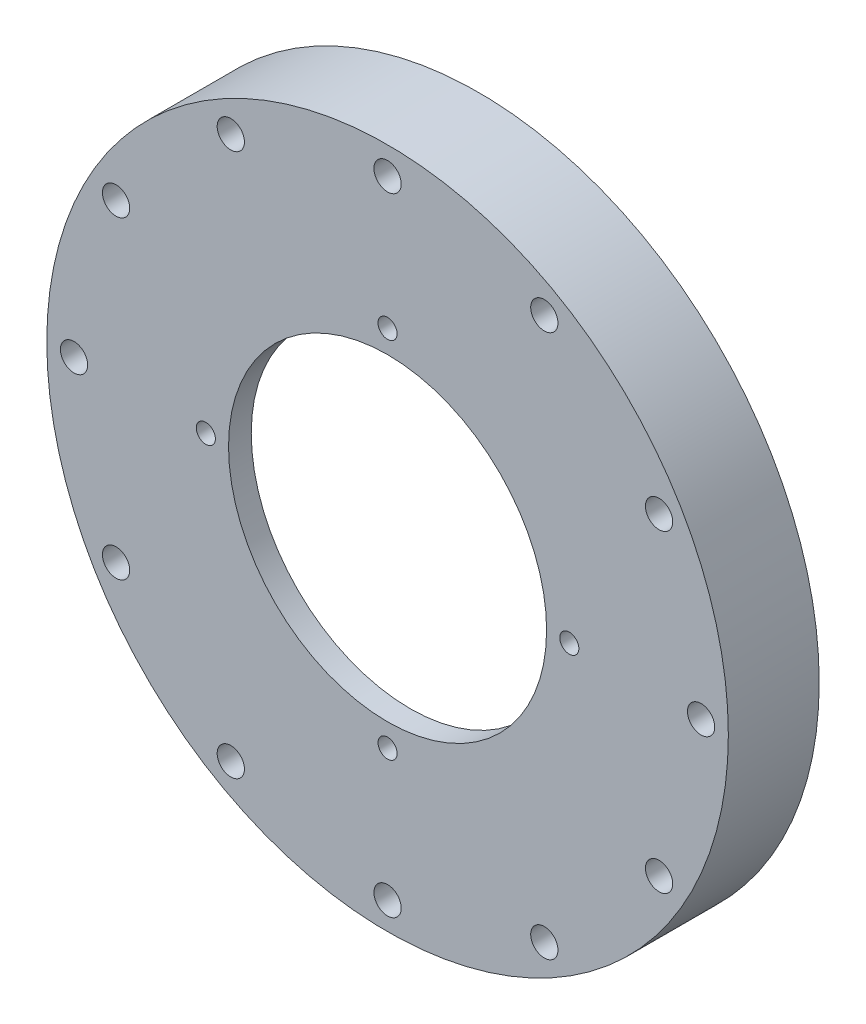
ISO-10303-21;
HEADER;
FILE_DESCRIPTION(('STEP AP214'),'2;1');
FILE_NAME('part.step','',(''),(''),'','','');
FILE_SCHEMA(('AUTOMOTIVE_DESIGN { 1 0 10303 214 1 1 1 1 }'));
ENDSEC;
DATA;
#1=APPLICATION_CONTEXT('core data for automotive mechanical design processes');
#2=APPLICATION_PROTOCOL_DEFINITION('international standard','automotive_design',2000,#1);
#3=PRODUCT_CONTEXT('',#1,'mechanical');
#4=PRODUCT('Part','Part','',(#3));
#5=PRODUCT_RELATED_PRODUCT_CATEGORY('part','',(#4));
#6=PRODUCT_DEFINITION_FORMATION('','',#4);
#7=PRODUCT_DEFINITION_CONTEXT('part definition',#1,'design');
#8=PRODUCT_DEFINITION('design','',#6,#7);
#9=PRODUCT_DEFINITION_SHAPE('','',#8);
#10=(LENGTH_UNIT() NAMED_UNIT(*) SI_UNIT(.MILLI.,.METRE.));
#11=(NAMED_UNIT(*) PLANE_ANGLE_UNIT() SI_UNIT($,.RADIAN.));
#12=(NAMED_UNIT(*) SI_UNIT($,.STERADIAN.) SOLID_ANGLE_UNIT());
#13=UNCERTAINTY_MEASURE_WITH_UNIT(LENGTH_MEASURE(1.E-05),#10,'distance_accuracy_value','');
#14=(GEOMETRIC_REPRESENTATION_CONTEXT(3) GLOBAL_UNCERTAINTY_ASSIGNED_CONTEXT((#13)) GLOBAL_UNIT_ASSIGNED_CONTEXT((#10,
#11,#12)) REPRESENTATION_CONTEXT('',''));
#15=CARTESIAN_POINT('',(0.,0.,0.));
#16=DIRECTION('',(0.,0.,1.));
#17=DIRECTION('',(1.,0.,0.));
#18=AXIS2_PLACEMENT_3D('',#15,#16,#17);
#19=CARTESIAN_POINT('',(0.,0.,20.));
#20=DIRECTION('',(0.,0.,1.));
#21=DIRECTION('',(1.,0.,0.));
#22=AXIS2_PLACEMENT_3D('',#19,#20,#21);
#23=PLANE('',#22);
#24=CARTESIAN_POINT('',(0.,40.,20.));
#25=DIRECTION('',(0.,0.,1.));
#26=DIRECTION('',(1.,0.,0.));
#27=AXIS2_PLACEMENT_3D('',#24,#25,#26);
#28=CIRCLE('',#27,2.09999999999999);
#29=CARTESIAN_POINT('',(2.09999999999999,40.,20.));
#30=VERTEX_POINT('',#29);
#31=EDGE_CURVE('E203',#30,#30,#28,.T.);
#32=ORIENTED_EDGE('',*,*,#31,.F.);
#33=EDGE_LOOP('',(#32));
#34=FACE_BOUND('',#33,.T.);
#35=CARTESIAN_POINT('',(40.,0.,20.));
#36=DIRECTION('',(0.,0.,1.));
#37=DIRECTION('',(1.,0.,0.));
#38=AXIS2_PLACEMENT_3D('',#35,#36,#37);
#39=CIRCLE('',#38,2.09999999999998);
#40=CARTESIAN_POINT('',(42.1,0.,20.));
#41=VERTEX_POINT('',#40);
#42=EDGE_CURVE('E195',#41,#41,#39,.T.);
#43=ORIENTED_EDGE('',*,*,#42,.F.);
#44=EDGE_LOOP('',(#43));
#45=FACE_BOUND('',#44,.T.);
#46=CARTESIAN_POINT('',(0.,-40.,20.));
#47=DIRECTION('',(0.,0.,1.));
#48=DIRECTION('',(1.,0.,0.));
#49=AXIS2_PLACEMENT_3D('',#46,#47,#48);
#50=CIRCLE('',#49,2.09999999999999);
#51=CARTESIAN_POINT('',(2.09999999999999,-40.,20.));
#52=VERTEX_POINT('',#51);
#53=EDGE_CURVE('E187',#52,#52,#50,.T.);
#54=ORIENTED_EDGE('',*,*,#53,.F.);
#55=EDGE_LOOP('',(#54));
#56=FACE_BOUND('',#55,.T.);
#57=CARTESIAN_POINT('',(-40.,0.,20.));
#58=DIRECTION('',(0.,0.,1.));
#59=DIRECTION('',(1.,0.,0.));
#60=AXIS2_PLACEMENT_3D('',#57,#58,#59);
#61=CIRCLE('',#60,2.09999999999998);
#62=CARTESIAN_POINT('',(-37.9,0.,20.));
#63=VERTEX_POINT('',#62);
#64=EDGE_CURVE('E179',#63,#63,#61,.T.);
#65=ORIENTED_EDGE('',*,*,#64,.F.);
#66=EDGE_LOOP('',(#65));
#67=FACE_BOUND('',#66,.T.);
#68=CARTESIAN_POINT('',(-34.5000000000011,-59.7557528611256,20.));
#69=DIRECTION('',(0.,0.,1.));
#70=DIRECTION('',(1.,0.,0.));
#71=AXIS2_PLACEMENT_3D('',#68,#69,#70);
#72=CIRCLE('',#71,3.00000000000001);
#73=CARTESIAN_POINT('',(-31.5000000000011,-59.7557528611256,20.));
#74=VERTEX_POINT('',#73);
#75=EDGE_CURVE('E148',#74,#74,#72,.T.);
#76=ORIENTED_EDGE('',*,*,#75,.F.);
#77=EDGE_LOOP('',(#76));
#78=FACE_BOUND('',#77,.T.);
#79=CARTESIAN_POINT('',(34.499999999999,-59.7557528611268,20.));
#80=DIRECTION('',(0.,0.,1.));
#81=DIRECTION('',(1.,0.,0.));
#82=AXIS2_PLACEMENT_3D('',#79,#80,#81);
#83=CIRCLE('',#82,3.00000000000001);
#84=CARTESIAN_POINT('',(37.499999999999,-59.7557528611268,20.));
#85=VERTEX_POINT('',#84);
#86=EDGE_CURVE('E132',#85,#85,#83,.T.);
#87=ORIENTED_EDGE('',*,*,#86,.F.);
#88=EDGE_LOOP('',(#87));
#89=FACE_BOUND('',#88,.T.);
#90=CARTESIAN_POINT('',(69.,-9.60157368181862E-13,20.));
#91=DIRECTION('',(0.,0.,1.));
#92=DIRECTION('',(1.,0.,0.));
#93=AXIS2_PLACEMENT_3D('',#90,#91,#92);
#94=CIRCLE('',#93,3.);
#95=CARTESIAN_POINT('',(72.,-9.60157368181862E-13,20.));
#96=VERTEX_POINT('',#95);
#97=EDGE_CURVE('E116',#96,#96,#94,.T.);
#98=ORIENTED_EDGE('',*,*,#97,.F.);
#99=EDGE_LOOP('',(#98));
#100=FACE_BOUND('',#99,.T.);
#101=CARTESIAN_POINT('',(59.7557528611267,34.4999999999992,20.));
#102=DIRECTION('',(0.,0.,1.));
#103=DIRECTION('',(1.,0.,0.));
#104=AXIS2_PLACEMENT_3D('',#101,#102,#103);
#105=CIRCLE('',#104,3.);
#106=CARTESIAN_POINT('',(62.7557528611267,34.4999999999992,20.));
#107=VERTEX_POINT('',#106);
#108=EDGE_CURVE('E100',#107,#107,#105,.T.);
#109=ORIENTED_EDGE('',*,*,#108,.F.);
#110=EDGE_LOOP('',(#109));
#111=FACE_BOUND('',#110,.T.);
#112=CARTESIAN_POINT('',(7.331229436095E-13,69.,20.));
#113=DIRECTION('',(0.,0.,1.));
#114=DIRECTION('',(1.,0.,0.));
#115=AXIS2_PLACEMENT_3D('',#112,#113,#114);
#116=CIRCLE('',#115,3.);
#117=CARTESIAN_POINT('',(3.00000000000074,69.,20.));
#118=VERTEX_POINT('',#117);
#119=EDGE_CURVE('E84',#118,#118,#116,.T.);
#120=ORIENTED_EDGE('',*,*,#119,.F.);
#121=EDGE_LOOP('',(#120));
#122=FACE_BOUND('',#121,.T.);
#123=CARTESIAN_POINT('',(-59.755752861126,34.5000000000005,20.));
#124=DIRECTION('',(0.,0.,1.));
#125=DIRECTION('',(1.,0.,0.));
#126=AXIS2_PLACEMENT_3D('',#123,#124,#125);
#127=CIRCLE('',#126,3.00000000000001);
#128=CARTESIAN_POINT('',(-56.755752861126,34.5000000000005,20.));
#129=VERTEX_POINT('',#128);
#130=EDGE_CURVE('E71',#129,#129,#127,.T.);
#131=ORIENTED_EDGE('',*,*,#130,.F.);
#132=EDGE_LOOP('',(#131));
#133=FACE_BOUND('',#132,.T.);
#134=CARTESIAN_POINT('',(0.,0.,20.));
#135=DIRECTION('',(0.,0.,1.));
#136=DIRECTION('',(1.,0.,0.));
#137=AXIS2_PLACEMENT_3D('',#134,#135,#136);
#138=CIRCLE('',#137,75.);
#139=CARTESIAN_POINT('',(75.,0.,20.));
#140=VERTEX_POINT('',#139);
#141=EDGE_CURVE('E12',#140,#140,#138,.T.);
#142=ORIENTED_EDGE('',*,*,#141,.T.);
#143=EDGE_LOOP('',(#142));
#144=FACE_BOUND('',#143,.T.);
#145=CARTESIAN_POINT('',(0.,0.,20.));
#146=DIRECTION('',(0.,0.,1.));
#147=DIRECTION('',(1.,0.,0.));
#148=AXIS2_PLACEMENT_3D('',#145,#146,#147);
#149=CIRCLE('',#148,35.);
#150=CARTESIAN_POINT('',(35.,0.,20.));
#151=VERTEX_POINT('',#150);
#152=EDGE_CURVE('E66',#151,#151,#149,.T.);
#153=ORIENTED_EDGE('',*,*,#152,.F.);
#154=EDGE_LOOP('',(#153));
#155=FACE_BOUND('',#154,.T.);
#156=CARTESIAN_POINT('',(-34.4999999999994,59.7557528611266,20.));
#157=DIRECTION('',(0.,0.,1.));
#158=DIRECTION('',(1.,0.,0.));
#159=AXIS2_PLACEMENT_3D('',#156,#157,#158);
#160=CIRCLE('',#159,3.);
#161=CARTESIAN_POINT('',(-31.4999999999994,59.7557528611266,20.));
#162=VERTEX_POINT('',#161);
#163=EDGE_CURVE('E76',#162,#162,#160,.T.);
#164=ORIENTED_EDGE('',*,*,#163,.F.);
#165=EDGE_LOOP('',(#164));
#166=FACE_BOUND('',#165,.T.);
#167=CARTESIAN_POINT('',(34.5000000000007,59.7557528611259,20.));
#168=DIRECTION('',(0.,0.,1.));
#169=DIRECTION('',(1.,0.,0.));
#170=AXIS2_PLACEMENT_3D('',#167,#168,#169);
#171=CIRCLE('',#170,3.00000000000002);
#172=CARTESIAN_POINT('',(37.5000000000007,59.7557528611259,20.));
#173=VERTEX_POINT('',#172);
#174=EDGE_CURVE('E92',#173,#173,#171,.T.);
#175=ORIENTED_EDGE('',*,*,#174,.F.);
#176=EDGE_LOOP('',(#175));
#177=FACE_BOUND('',#176,.T.);
#178=CARTESIAN_POINT('',(-69.,4.78332943421509E-13,20.));
#179=DIRECTION('',(0.,0.,1.));
#180=DIRECTION('',(1.,0.,0.));
#181=AXIS2_PLACEMENT_3D('',#178,#179,#180);
#182=CIRCLE('',#181,3.00000000000001);
#183=CARTESIAN_POINT('',(-66.,4.78332943421509E-13,20.));
#184=VERTEX_POINT('',#183);
#185=EDGE_CURVE('E108',#184,#184,#182,.T.);
#186=ORIENTED_EDGE('',*,*,#185,.F.);
#187=EDGE_LOOP('',(#186));
#188=FACE_BOUND('',#187,.T.);
#189=CARTESIAN_POINT('',(59.7557528611258,-34.5000000000009,20.));
#190=DIRECTION('',(0.,0.,1.));
#191=DIRECTION('',(1.,0.,0.));
#192=AXIS2_PLACEMENT_3D('',#189,#190,#191);
#193=CIRCLE('',#192,3.00000000000001);
#194=CARTESIAN_POINT('',(62.7557528611258,-34.5000000000009,20.));
#195=VERTEX_POINT('',#194);
#196=EDGE_CURVE('E124',#195,#195,#193,.T.);
#197=ORIENTED_EDGE('',*,*,#196,.F.);
#198=EDGE_LOOP('',(#197));
#199=FACE_BOUND('',#198,.T.);
#200=CARTESIAN_POINT('',(-1.21494736836985E-12,-69.,20.));
#201=DIRECTION('',(0.,0.,1.));
#202=DIRECTION('',(1.,0.,0.));
#203=AXIS2_PLACEMENT_3D('',#200,#201,#202);
#204=CIRCLE('',#203,3.00000000000001);
#205=CARTESIAN_POINT('',(2.9999999999988,-69.,20.));
#206=VERTEX_POINT('',#205);
#207=EDGE_CURVE('E140',#206,#206,#204,.T.);
#208=ORIENTED_EDGE('',*,*,#207,.F.);
#209=EDGE_LOOP('',(#208));
#210=FACE_BOUND('',#209,.T.);
#211=CARTESIAN_POINT('',(-59.7557528611269,-34.4999999999988,20.));
#212=DIRECTION('',(0.,0.,1.));
#213=DIRECTION('',(1.,0.,0.));
#214=AXIS2_PLACEMENT_3D('',#211,#212,#213);
#215=CIRCLE('',#214,3.00000000000001);
#216=CARTESIAN_POINT('',(-56.7557528611269,-34.4999999999988,20.));
#217=VERTEX_POINT('',#216);
#218=EDGE_CURVE('E156',#217,#217,#215,.T.);
#219=ORIENTED_EDGE('',*,*,#218,.F.);
#220=EDGE_LOOP('',(#219));
#221=FACE_BOUND('',#220,.T.);
#222=ADVANCED_FACE('F51',(#34,#45,#56,#67,#78,#89,#100,#111,#122,#133,#144,#155,#166,#177,#188,
#199,#210,#221),#23,.T.);
#223=CARTESIAN_POINT('',(0.,0.,0.));
#224=DIRECTION('',(0.,0.,1.));
#225=DIRECTION('',(1.,0.,0.));
#226=AXIS2_PLACEMENT_3D('',#223,#224,#225);
#227=PLANE('',#226);
#228=CARTESIAN_POINT('',(0.,0.,0.));
#229=DIRECTION('',(0.,0.,1.));
#230=DIRECTION('',(1.,0.,0.));
#231=AXIS2_PLACEMENT_3D('',#228,#229,#230);
#232=CIRCLE('',#231,60.);
#233=CARTESIAN_POINT('',(60.,0.,0.));
#234=VERTEX_POINT('',#233);
#235=EDGE_CURVE('E167',#234,#234,#232,.T.);
#236=ORIENTED_EDGE('',*,*,#235,.T.);
#237=EDGE_LOOP('',(#236));
#238=FACE_BOUND('',#237,.T.);
#239=CARTESIAN_POINT('',(0.,0.,0.));
#240=DIRECTION('',(0.,0.,1.));
#241=DIRECTION('',(1.,0.,0.));
#242=AXIS2_PLACEMENT_3D('',#239,#240,#241);
#243=CIRCLE('',#242,75.);
#244=CARTESIAN_POINT('',(75.,0.,0.));
#245=VERTEX_POINT('',#244);
#246=EDGE_CURVE('E60',#245,#245,#243,.T.);
#247=ORIENTED_EDGE('',*,*,#246,.F.);
#248=EDGE_LOOP('',(#247));
#249=FACE_BOUND('',#248,.T.);
#250=CARTESIAN_POINT('',(-59.755752861126,34.5000000000005,0.));
#251=DIRECTION('',(0.,0.,1.));
#252=DIRECTION('',(1.,0.,0.));
#253=AXIS2_PLACEMENT_3D('',#250,#251,#252);
#254=CIRCLE('',#253,3.00000000000001);
#255=CARTESIAN_POINT('',(-56.755752861126,34.5000000000005,0.));
#256=VERTEX_POINT('',#255);
#257=EDGE_CURVE('E72',#256,#256,#254,.T.);
#258=ORIENTED_EDGE('',*,*,#257,.T.);
#259=EDGE_LOOP('',(#258));
#260=FACE_BOUND('',#259,.T.);
#261=CARTESIAN_POINT('',(-34.4999999999994,59.7557528611266,0.));
#262=DIRECTION('',(0.,0.,1.));
#263=DIRECTION('',(1.,0.,0.));
#264=AXIS2_PLACEMENT_3D('',#261,#262,#263);
#265=CIRCLE('',#264,3.);
#266=CARTESIAN_POINT('',(-31.4999999999994,59.7557528611266,0.));
#267=VERTEX_POINT('',#266);
#268=EDGE_CURVE('E80',#267,#267,#265,.T.);
#269=ORIENTED_EDGE('',*,*,#268,.T.);
#270=EDGE_LOOP('',(#269));
#271=FACE_BOUND('',#270,.T.);
#272=CARTESIAN_POINT('',(7.331229436095E-13,69.,0.));
#273=DIRECTION('',(0.,0.,1.));
#274=DIRECTION('',(1.,0.,0.));
#275=AXIS2_PLACEMENT_3D('',#272,#273,#274);
#276=CIRCLE('',#275,3.);
#277=CARTESIAN_POINT('',(3.00000000000074,69.,0.));
#278=VERTEX_POINT('',#277);
#279=EDGE_CURVE('E88',#278,#278,#276,.T.);
#280=ORIENTED_EDGE('',*,*,#279,.T.);
#281=EDGE_LOOP('',(#280));
#282=FACE_BOUND('',#281,.T.);
#283=CARTESIAN_POINT('',(34.5000000000007,59.7557528611259,0.));
#284=DIRECTION('',(0.,0.,1.));
#285=DIRECTION('',(1.,0.,0.));
#286=AXIS2_PLACEMENT_3D('',#283,#284,#285);
#287=CIRCLE('',#286,3.00000000000002);
#288=CARTESIAN_POINT('',(37.5000000000007,59.7557528611259,0.));
#289=VERTEX_POINT('',#288);
#290=EDGE_CURVE('E96',#289,#289,#287,.T.);
#291=ORIENTED_EDGE('',*,*,#290,.T.);
#292=EDGE_LOOP('',(#291));
#293=FACE_BOUND('',#292,.T.);
#294=CARTESIAN_POINT('',(59.7557528611267,34.4999999999992,0.));
#295=DIRECTION('',(0.,0.,1.));
#296=DIRECTION('',(1.,0.,0.));
#297=AXIS2_PLACEMENT_3D('',#294,#295,#296);
#298=CIRCLE('',#297,3.);
#299=CARTESIAN_POINT('',(62.7557528611267,34.4999999999992,0.));
#300=VERTEX_POINT('',#299);
#301=EDGE_CURVE('E104',#300,#300,#298,.T.);
#302=ORIENTED_EDGE('',*,*,#301,.T.);
#303=EDGE_LOOP('',(#302));
#304=FACE_BOUND('',#303,.T.);
#305=CARTESIAN_POINT('',(-69.,4.78332943421509E-13,0.));
#306=DIRECTION('',(0.,0.,1.));
#307=DIRECTION('',(1.,0.,0.));
#308=AXIS2_PLACEMENT_3D('',#305,#306,#307);
#309=CIRCLE('',#308,3.00000000000001);
#310=CARTESIAN_POINT('',(-66.,4.78332943421509E-13,0.));
#311=VERTEX_POINT('',#310);
#312=EDGE_CURVE('E112',#311,#311,#309,.T.);
#313=ORIENTED_EDGE('',*,*,#312,.T.);
#314=EDGE_LOOP('',(#313));
#315=FACE_BOUND('',#314,.T.);
#316=CARTESIAN_POINT('',(69.,-9.60157368181862E-13,0.));
#317=DIRECTION('',(0.,0.,1.));
#318=DIRECTION('',(1.,0.,0.));
#319=AXIS2_PLACEMENT_3D('',#316,#317,#318);
#320=CIRCLE('',#319,3.);
#321=CARTESIAN_POINT('',(72.,-9.60157368181862E-13,0.));
#322=VERTEX_POINT('',#321);
#323=EDGE_CURVE('E120',#322,#322,#320,.T.);
#324=ORIENTED_EDGE('',*,*,#323,.T.);
#325=EDGE_LOOP('',(#324));
#326=FACE_BOUND('',#325,.T.);
#327=CARTESIAN_POINT('',(59.7557528611258,-34.5000000000009,0.));
#328=DIRECTION('',(0.,0.,1.));
#329=DIRECTION('',(1.,0.,0.));
#330=AXIS2_PLACEMENT_3D('',#327,#328,#329);
#331=CIRCLE('',#330,3.00000000000001);
#332=CARTESIAN_POINT('',(62.7557528611258,-34.5000000000009,0.));
#333=VERTEX_POINT('',#332);
#334=EDGE_CURVE('E128',#333,#333,#331,.T.);
#335=ORIENTED_EDGE('',*,*,#334,.T.);
#336=EDGE_LOOP('',(#335));
#337=FACE_BOUND('',#336,.T.);
#338=CARTESIAN_POINT('',(34.499999999999,-59.7557528611268,0.));
#339=DIRECTION('',(0.,0.,1.));
#340=DIRECTION('',(1.,0.,0.));
#341=AXIS2_PLACEMENT_3D('',#338,#339,#340);
#342=CIRCLE('',#341,3.00000000000001);
#343=CARTESIAN_POINT('',(37.499999999999,-59.7557528611268,0.));
#344=VERTEX_POINT('',#343);
#345=EDGE_CURVE('E136',#344,#344,#342,.T.);
#346=ORIENTED_EDGE('',*,*,#345,.T.);
#347=EDGE_LOOP('',(#346));
#348=FACE_BOUND('',#347,.T.);
#349=CARTESIAN_POINT('',(-1.21494736836985E-12,-69.,0.));
#350=DIRECTION('',(0.,0.,1.));
#351=DIRECTION('',(1.,0.,0.));
#352=AXIS2_PLACEMENT_3D('',#349,#350,#351);
#353=CIRCLE('',#352,3.00000000000001);
#354=CARTESIAN_POINT('',(2.9999999999988,-69.,0.));
#355=VERTEX_POINT('',#354);
#356=EDGE_CURVE('E144',#355,#355,#353,.T.);
#357=ORIENTED_EDGE('',*,*,#356,.T.);
#358=EDGE_LOOP('',(#357));
#359=FACE_BOUND('',#358,.T.);
#360=CARTESIAN_POINT('',(-34.5000000000011,-59.7557528611256,0.));
#361=DIRECTION('',(0.,0.,1.));
#362=DIRECTION('',(1.,0.,0.));
#363=AXIS2_PLACEMENT_3D('',#360,#361,#362);
#364=CIRCLE('',#363,3.00000000000001);
#365=CARTESIAN_POINT('',(-31.5000000000011,-59.7557528611256,0.));
#366=VERTEX_POINT('',#365);
#367=EDGE_CURVE('E152',#366,#366,#364,.T.);
#368=ORIENTED_EDGE('',*,*,#367,.T.);
#369=EDGE_LOOP('',(#368));
#370=FACE_BOUND('',#369,.T.);
#371=CARTESIAN_POINT('',(-59.7557528611269,-34.4999999999988,0.));
#372=DIRECTION('',(0.,0.,1.));
#373=DIRECTION('',(1.,0.,0.));
#374=AXIS2_PLACEMENT_3D('',#371,#372,#373);
#375=CIRCLE('',#374,3.00000000000001);
#376=CARTESIAN_POINT('',(-56.7557528611269,-34.4999999999988,0.));
#377=VERTEX_POINT('',#376);
#378=EDGE_CURVE('E160',#377,#377,#375,.T.);
#379=ORIENTED_EDGE('',*,*,#378,.T.);
#380=EDGE_LOOP('',(#379));
#381=FACE_BOUND('',#380,.T.);
#382=ADVANCED_FACE('F213',(#238,#249,#260,#271,#282,#293,#304,#315,#326,#337,#348,#359,#370,
#381),#227,.F.);
#383=CARTESIAN_POINT('',(0.,0.,20.));
#384=DIRECTION('',(0.,0.,-1.));
#385=DIRECTION('',(-1.,0.,0.));
#386=AXIS2_PLACEMENT_3D('',#383,#384,#385);
#387=CYLINDRICAL_SURFACE('',#386,75.);
#388=ORIENTED_EDGE('',*,*,#141,.F.);
#389=EDGE_LOOP('',(#388));
#390=FACE_BOUND('',#389,.T.);
#391=ORIENTED_EDGE('',*,*,#246,.T.);
#392=EDGE_LOOP('',(#391));
#393=FACE_BOUND('',#392,.T.);
#394=ADVANCED_FACE('F53',(#390,#393),#387,.T.);
#395=CARTESIAN_POINT('',(0.,0.,20.));
#396=DIRECTION('',(0.,0.,-1.));
#397=DIRECTION('',(-1.,0.,0.));
#398=AXIS2_PLACEMENT_3D('',#395,#396,#397);
#399=CYLINDRICAL_SURFACE('',#398,35.);
#400=CARTESIAN_POINT('',(0.,0.,15.));
#401=DIRECTION('',(0.,0.,1.));
#402=DIRECTION('',(1.,0.,0.));
#403=AXIS2_PLACEMENT_3D('',#400,#401,#402);
#404=CIRCLE('',#403,35.);
#405=CARTESIAN_POINT('',(35.,0.,15.));
#406=VERTEX_POINT('',#405);
#407=EDGE_CURVE('E55',#406,#406,#404,.T.);
#408=ORIENTED_EDGE('',*,*,#407,.F.);
#409=EDGE_LOOP('',(#408));
#410=FACE_BOUND('',#409,.T.);
#411=ORIENTED_EDGE('',*,*,#152,.T.);
#412=EDGE_LOOP('',(#411));
#413=FACE_BOUND('',#412,.T.);
#414=ADVANCED_FACE('F260',(#410,#413),#399,.F.);
#415=CARTESIAN_POINT('',(-59.755752861126,34.5000000000005,20.));
#416=DIRECTION('',(0.,0.,-1.));
#417=DIRECTION('',(-1.,0.,0.));
#418=AXIS2_PLACEMENT_3D('',#415,#416,#417);
#419=CYLINDRICAL_SURFACE('',#418,3.00000000000001);
#420=ORIENTED_EDGE('',*,*,#130,.T.);
#421=EDGE_LOOP('',(#420));
#422=FACE_BOUND('',#421,.T.);
#423=ORIENTED_EDGE('',*,*,#257,.F.);
#424=EDGE_LOOP('',(#423));
#425=FACE_BOUND('',#424,.T.);
#426=ADVANCED_FACE('F266',(#422,#425),#419,.F.);
#427=CARTESIAN_POINT('',(-34.4999999999994,59.7557528611266,20.));
#428=DIRECTION('',(0.,0.,-1.));
#429=DIRECTION('',(-1.,0.,0.));
#430=AXIS2_PLACEMENT_3D('',#427,#428,#429);
#431=CYLINDRICAL_SURFACE('',#430,3.);
#432=ORIENTED_EDGE('',*,*,#163,.T.);
#433=EDGE_LOOP('',(#432));
#434=FACE_BOUND('',#433,.T.);
#435=ORIENTED_EDGE('',*,*,#268,.F.);
#436=EDGE_LOOP('',(#435));
#437=FACE_BOUND('',#436,.T.);
#438=ADVANCED_FACE('F270',(#434,#437),#431,.F.);
#439=CARTESIAN_POINT('',(7.331229436095E-13,69.,20.));
#440=DIRECTION('',(0.,0.,-1.));
#441=DIRECTION('',(-1.,0.,0.));
#442=AXIS2_PLACEMENT_3D('',#439,#440,#441);
#443=CYLINDRICAL_SURFACE('',#442,3.);
#444=ORIENTED_EDGE('',*,*,#119,.T.);
#445=EDGE_LOOP('',(#444));
#446=FACE_BOUND('',#445,.T.);
#447=ORIENTED_EDGE('',*,*,#279,.F.);
#448=EDGE_LOOP('',(#447));
#449=FACE_BOUND('',#448,.T.);
#450=ADVANCED_FACE('F274',(#446,#449),#443,.F.);
#451=CARTESIAN_POINT('',(34.5000000000007,59.7557528611259,20.));
#452=DIRECTION('',(0.,0.,-1.));
#453=DIRECTION('',(-1.,0.,0.));
#454=AXIS2_PLACEMENT_3D('',#451,#452,#453);
#455=CYLINDRICAL_SURFACE('',#454,3.00000000000002);
#456=ORIENTED_EDGE('',*,*,#174,.T.);
#457=EDGE_LOOP('',(#456));
#458=FACE_BOUND('',#457,.T.);
#459=ORIENTED_EDGE('',*,*,#290,.F.);
#460=EDGE_LOOP('',(#459));
#461=FACE_BOUND('',#460,.T.);
#462=ADVANCED_FACE('F278',(#458,#461),#455,.F.);
#463=CARTESIAN_POINT('',(59.7557528611267,34.4999999999992,20.));
#464=DIRECTION('',(0.,0.,-1.));
#465=DIRECTION('',(-1.,0.,0.));
#466=AXIS2_PLACEMENT_3D('',#463,#464,#465);
#467=CYLINDRICAL_SURFACE('',#466,3.);
#468=ORIENTED_EDGE('',*,*,#108,.T.);
#469=EDGE_LOOP('',(#468));
#470=FACE_BOUND('',#469,.T.);
#471=ORIENTED_EDGE('',*,*,#301,.F.);
#472=EDGE_LOOP('',(#471));
#473=FACE_BOUND('',#472,.T.);
#474=ADVANCED_FACE('F282',(#470,#473),#467,.F.);
#475=CARTESIAN_POINT('',(-69.,4.78332943421509E-13,20.));
#476=DIRECTION('',(0.,0.,-1.));
#477=DIRECTION('',(-1.,0.,0.));
#478=AXIS2_PLACEMENT_3D('',#475,#476,#477);
#479=CYLINDRICAL_SURFACE('',#478,3.00000000000001);
#480=ORIENTED_EDGE('',*,*,#185,.T.);
#481=EDGE_LOOP('',(#480));
#482=FACE_BOUND('',#481,.T.);
#483=ORIENTED_EDGE('',*,*,#312,.F.);
#484=EDGE_LOOP('',(#483));
#485=FACE_BOUND('',#484,.T.);
#486=ADVANCED_FACE('F286',(#482,#485),#479,.F.);
#487=CARTESIAN_POINT('',(69.,-9.60157368181862E-13,20.));
#488=DIRECTION('',(0.,0.,-1.));
#489=DIRECTION('',(-1.,0.,0.));
#490=AXIS2_PLACEMENT_3D('',#487,#488,#489);
#491=CYLINDRICAL_SURFACE('',#490,3.);
#492=ORIENTED_EDGE('',*,*,#97,.T.);
#493=EDGE_LOOP('',(#492));
#494=FACE_BOUND('',#493,.T.);
#495=ORIENTED_EDGE('',*,*,#323,.F.);
#496=EDGE_LOOP('',(#495));
#497=FACE_BOUND('',#496,.T.);
#498=ADVANCED_FACE('F290',(#494,#497),#491,.F.);
#499=CARTESIAN_POINT('',(59.7557528611258,-34.5000000000009,20.));
#500=DIRECTION('',(0.,0.,-1.));
#501=DIRECTION('',(-1.,0.,0.));
#502=AXIS2_PLACEMENT_3D('',#499,#500,#501);
#503=CYLINDRICAL_SURFACE('',#502,3.00000000000001);
#504=ORIENTED_EDGE('',*,*,#196,.T.);
#505=EDGE_LOOP('',(#504));
#506=FACE_BOUND('',#505,.T.);
#507=ORIENTED_EDGE('',*,*,#334,.F.);
#508=EDGE_LOOP('',(#507));
#509=FACE_BOUND('',#508,.T.);
#510=ADVANCED_FACE('F294',(#506,#509),#503,.F.);
#511=CARTESIAN_POINT('',(34.499999999999,-59.7557528611268,20.));
#512=DIRECTION('',(0.,0.,-1.));
#513=DIRECTION('',(-1.,0.,0.));
#514=AXIS2_PLACEMENT_3D('',#511,#512,#513);
#515=CYLINDRICAL_SURFACE('',#514,3.00000000000001);
#516=ORIENTED_EDGE('',*,*,#86,.T.);
#517=EDGE_LOOP('',(#516));
#518=FACE_BOUND('',#517,.T.);
#519=ORIENTED_EDGE('',*,*,#345,.F.);
#520=EDGE_LOOP('',(#519));
#521=FACE_BOUND('',#520,.T.);
#522=ADVANCED_FACE('F298',(#518,#521),#515,.F.);
#523=CARTESIAN_POINT('',(-1.21494736836985E-12,-69.,20.));
#524=DIRECTION('',(0.,0.,-1.));
#525=DIRECTION('',(-1.,0.,0.));
#526=AXIS2_PLACEMENT_3D('',#523,#524,#525);
#527=CYLINDRICAL_SURFACE('',#526,3.00000000000001);
#528=ORIENTED_EDGE('',*,*,#207,.T.);
#529=EDGE_LOOP('',(#528));
#530=FACE_BOUND('',#529,.T.);
#531=ORIENTED_EDGE('',*,*,#356,.F.);
#532=EDGE_LOOP('',(#531));
#533=FACE_BOUND('',#532,.T.);
#534=ADVANCED_FACE('F302',(#530,#533),#527,.F.);
#535=CARTESIAN_POINT('',(-34.5000000000011,-59.7557528611256,20.));
#536=DIRECTION('',(0.,0.,-1.));
#537=DIRECTION('',(-1.,0.,0.));
#538=AXIS2_PLACEMENT_3D('',#535,#536,#537);
#539=CYLINDRICAL_SURFACE('',#538,3.00000000000001);
#540=ORIENTED_EDGE('',*,*,#75,.T.);
#541=EDGE_LOOP('',(#540));
#542=FACE_BOUND('',#541,.T.);
#543=ORIENTED_EDGE('',*,*,#367,.F.);
#544=EDGE_LOOP('',(#543));
#545=FACE_BOUND('',#544,.T.);
#546=ADVANCED_FACE('F251',(#542,#545),#539,.F.);
#547=CARTESIAN_POINT('',(-59.7557528611269,-34.4999999999988,20.));
#548=DIRECTION('',(0.,0.,-1.));
#549=DIRECTION('',(-1.,0.,0.));
#550=AXIS2_PLACEMENT_3D('',#547,#548,#549);
#551=CYLINDRICAL_SURFACE('',#550,3.00000000000001);
#552=ORIENTED_EDGE('',*,*,#218,.T.);
#553=EDGE_LOOP('',(#552));
#554=FACE_BOUND('',#553,.T.);
#555=ORIENTED_EDGE('',*,*,#378,.F.);
#556=EDGE_LOOP('',(#555));
#557=FACE_BOUND('',#556,.T.);
#558=ADVANCED_FACE('F247',(#554,#557),#551,.F.);
#559=CARTESIAN_POINT('',(0.,0.,15.));
#560=DIRECTION('',(0.,0.,-1.));
#561=DIRECTION('',(-1.,0.,0.));
#562=AXIS2_PLACEMENT_3D('',#559,#560,#561);
#563=CYLINDRICAL_SURFACE('',#562,60.);
#564=CARTESIAN_POINT('',(0.,0.,15.));
#565=DIRECTION('',(0.,0.,1.));
#566=DIRECTION('',(1.,0.,0.));
#567=AXIS2_PLACEMENT_3D('',#564,#565,#566);
#568=CIRCLE('',#567,60.);
#569=CARTESIAN_POINT('',(60.,0.,15.));
#570=VERTEX_POINT('',#569);
#571=EDGE_CURVE('E171',#570,#570,#568,.T.);
#572=ORIENTED_EDGE('',*,*,#571,.T.);
#573=EDGE_LOOP('',(#572));
#574=FACE_BOUND('',#573,.T.);
#575=ORIENTED_EDGE('',*,*,#235,.F.);
#576=EDGE_LOOP('',(#575));
#577=FACE_BOUND('',#576,.T.);
#578=ADVANCED_FACE('F250',(#574,#577),#563,.F.);
#579=CARTESIAN_POINT('',(0.,0.,15.));
#580=DIRECTION('',(0.,0.,1.));
#581=DIRECTION('',(1.,0.,0.));
#582=AXIS2_PLACEMENT_3D('',#579,#580,#581);
#583=PLANE('',#582);
#584=CARTESIAN_POINT('',(0.,40.,15.));
#585=DIRECTION('',(0.,0.,1.));
#586=DIRECTION('',(1.,0.,0.));
#587=AXIS2_PLACEMENT_3D('',#584,#585,#586);
#588=CIRCLE('',#587,2.09999999999999);
#589=CARTESIAN_POINT('',(2.09999999999999,40.,15.));
#590=VERTEX_POINT('',#589);
#591=EDGE_CURVE('E199',#590,#590,#588,.T.);
#592=ORIENTED_EDGE('',*,*,#591,.T.);
#593=EDGE_LOOP('',(#592));
#594=FACE_BOUND('',#593,.T.);
#595=CARTESIAN_POINT('',(40.,0.,15.));
#596=DIRECTION('',(0.,0.,1.));
#597=DIRECTION('',(1.,0.,0.));
#598=AXIS2_PLACEMENT_3D('',#595,#596,#597);
#599=CIRCLE('',#598,2.09999999999998);
#600=CARTESIAN_POINT('',(42.1,0.,15.));
#601=VERTEX_POINT('',#600);
#602=EDGE_CURVE('E191',#601,#601,#599,.T.);
#603=ORIENTED_EDGE('',*,*,#602,.T.);
#604=EDGE_LOOP('',(#603));
#605=FACE_BOUND('',#604,.T.);
#606=CARTESIAN_POINT('',(0.,-40.,15.));
#607=DIRECTION('',(0.,0.,1.));
#608=DIRECTION('',(1.,0.,0.));
#609=AXIS2_PLACEMENT_3D('',#606,#607,#608);
#610=CIRCLE('',#609,2.09999999999999);
#611=CARTESIAN_POINT('',(2.09999999999999,-40.,15.));
#612=VERTEX_POINT('',#611);
#613=EDGE_CURVE('E183',#612,#612,#610,.T.);
#614=ORIENTED_EDGE('',*,*,#613,.T.);
#615=EDGE_LOOP('',(#614));
#616=FACE_BOUND('',#615,.T.);
#617=CARTESIAN_POINT('',(-40.,0.,15.));
#618=DIRECTION('',(0.,0.,1.));
#619=DIRECTION('',(1.,0.,0.));
#620=AXIS2_PLACEMENT_3D('',#617,#618,#619);
#621=CIRCLE('',#620,2.09999999999998);
#622=CARTESIAN_POINT('',(-37.9,0.,15.));
#623=VERTEX_POINT('',#622);
#624=EDGE_CURVE('E172',#623,#623,#621,.T.);
#625=ORIENTED_EDGE('',*,*,#624,.T.);
#626=EDGE_LOOP('',(#625));
#627=FACE_BOUND('',#626,.T.);
#628=ORIENTED_EDGE('',*,*,#407,.T.);
#629=EDGE_LOOP('',(#628));
#630=FACE_BOUND('',#629,.T.);
#631=ORIENTED_EDGE('',*,*,#571,.F.);
#632=EDGE_LOOP('',(#631));
#633=FACE_BOUND('',#632,.T.);
#634=ADVANCED_FACE('F312',(#594,#605,#616,#627,#630,#633),#583,.F.);
#635=CARTESIAN_POINT('',(-40.,0.,20.));
#636=DIRECTION('',(0.,0.,1.));
#637=DIRECTION('',(1.,0.,0.));
#638=AXIS2_PLACEMENT_3D('',#635,#636,#637);
#639=CYLINDRICAL_SURFACE('',#638,2.09999999999998);
#640=ORIENTED_EDGE('',*,*,#64,.T.);
#641=EDGE_LOOP('',(#640));
#642=FACE_BOUND('',#641,.T.);
#643=ORIENTED_EDGE('',*,*,#624,.F.);
#644=EDGE_LOOP('',(#643));
#645=FACE_BOUND('',#644,.T.);
#646=ADVANCED_FACE('F316',(#642,#645),#639,.F.);
#647=CARTESIAN_POINT('',(0.,-40.,20.));
#648=DIRECTION('',(0.,0.,1.));
#649=DIRECTION('',(1.,0.,0.));
#650=AXIS2_PLACEMENT_3D('',#647,#648,#649);
#651=CYLINDRICAL_SURFACE('',#650,2.09999999999999);
#652=ORIENTED_EDGE('',*,*,#53,.T.);
#653=EDGE_LOOP('',(#652));
#654=FACE_BOUND('',#653,.T.);
#655=ORIENTED_EDGE('',*,*,#613,.F.);
#656=EDGE_LOOP('',(#655));
#657=FACE_BOUND('',#656,.T.);
#658=ADVANCED_FACE('F320',(#654,#657),#651,.F.);
#659=CARTESIAN_POINT('',(40.,0.,20.));
#660=DIRECTION('',(0.,0.,1.));
#661=DIRECTION('',(1.,0.,0.));
#662=AXIS2_PLACEMENT_3D('',#659,#660,#661);
#663=CYLINDRICAL_SURFACE('',#662,2.09999999999998);
#664=ORIENTED_EDGE('',*,*,#42,.T.);
#665=EDGE_LOOP('',(#664));
#666=FACE_BOUND('',#665,.T.);
#667=ORIENTED_EDGE('',*,*,#602,.F.);
#668=EDGE_LOOP('',(#667));
#669=FACE_BOUND('',#668,.T.);
#670=ADVANCED_FACE('F324',(#666,#669),#663,.F.);
#671=CARTESIAN_POINT('',(0.,40.,20.));
#672=DIRECTION('',(0.,0.,1.));
#673=DIRECTION('',(1.,0.,0.));
#674=AXIS2_PLACEMENT_3D('',#671,#672,#673);
#675=CYLINDRICAL_SURFACE('',#674,2.09999999999999);
#676=ORIENTED_EDGE('',*,*,#31,.T.);
#677=EDGE_LOOP('',(#676));
#678=FACE_BOUND('',#677,.T.);
#679=ORIENTED_EDGE('',*,*,#591,.F.);
#680=EDGE_LOOP('',(#679));
#681=FACE_BOUND('',#680,.T.);
#682=ADVANCED_FACE('F208',(#678,#681),#675,.F.);
#683=CLOSED_SHELL('',(#222,#382,#394,#414,#426,#438,#450,#462,#474,#486,#498,#510,#522,#534,
#546,#558,#578,#634,#646,#658,#670,#682));
#684=MANIFOLD_SOLID_BREP('B2',#683);
#685=ADVANCED_BREP_SHAPE_REPRESENTATION('',(#18,#684),#14);
#686=SHAPE_DEFINITION_REPRESENTATION(#9,#685);
ENDSEC;
END-ISO-10303-21;
